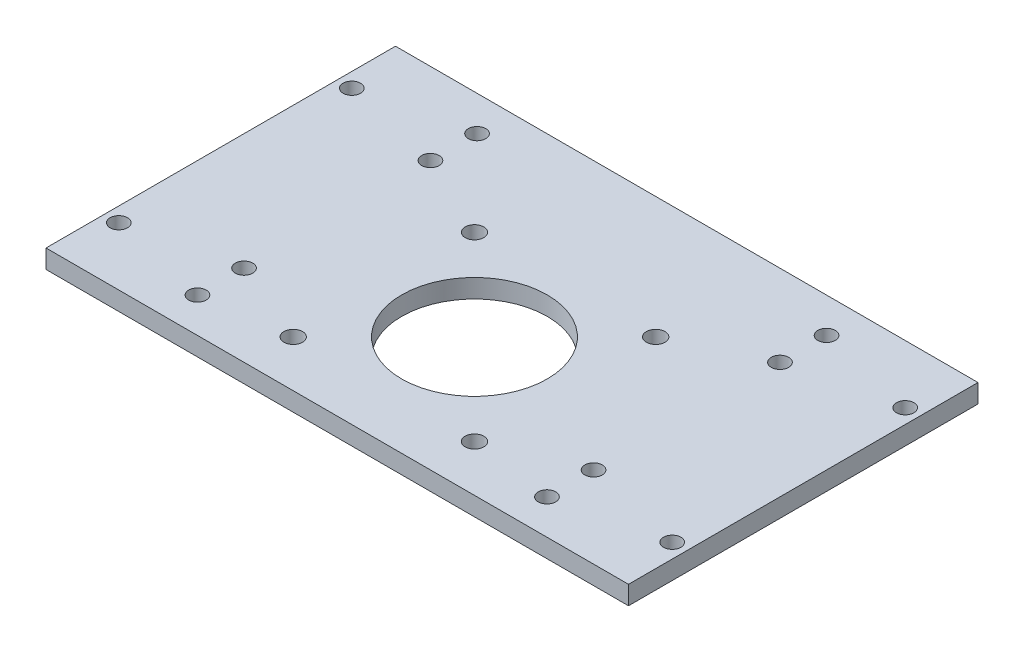
ISO-10303-21;
HEADER;
FILE_DESCRIPTION(('STEP AP214'),'2;1');
FILE_NAME('part.step','',(''),(''),'','','');
FILE_SCHEMA(('AUTOMOTIVE_DESIGN { 1 0 10303 214 1 1 1 1 }'));
ENDSEC;
DATA;
#1=APPLICATION_CONTEXT('core data for automotive mechanical design processes');
#2=APPLICATION_PROTOCOL_DEFINITION('international standard','automotive_design',2000,#1);
#3=PRODUCT_CONTEXT('',#1,'mechanical');
#4=PRODUCT('Part','Part','',(#3));
#5=PRODUCT_RELATED_PRODUCT_CATEGORY('part','',(#4));
#6=PRODUCT_DEFINITION_FORMATION('','',#4);
#7=PRODUCT_DEFINITION_CONTEXT('part definition',#1,'design');
#8=PRODUCT_DEFINITION('design','',#6,#7);
#9=PRODUCT_DEFINITION_SHAPE('','',#8);
#10=(LENGTH_UNIT() NAMED_UNIT(*) SI_UNIT(.MILLI.,.METRE.));
#11=(NAMED_UNIT(*) PLANE_ANGLE_UNIT() SI_UNIT($,.RADIAN.));
#12=(NAMED_UNIT(*) SI_UNIT($,.STERADIAN.) SOLID_ANGLE_UNIT());
#13=UNCERTAINTY_MEASURE_WITH_UNIT(LENGTH_MEASURE(1.E-05),#10,'distance_accuracy_value','');
#14=(GEOMETRIC_REPRESENTATION_CONTEXT(3) GLOBAL_UNCERTAINTY_ASSIGNED_CONTEXT((#13)) GLOBAL_UNIT_ASSIGNED_CONTEXT((#10,
#11,#12)) REPRESENTATION_CONTEXT('',''));
#15=CARTESIAN_POINT('',(0.,0.,0.));
#16=DIRECTION('',(0.,0.,1.));
#17=DIRECTION('',(1.,0.,0.));
#18=AXIS2_PLACEMENT_3D('',#15,#16,#17);
#19=CARTESIAN_POINT('',(-50.,3.2,-30.));
#20=DIRECTION('',(1.,0.,0.));
#21=DIRECTION('',(0.,0.,-1.));
#22=AXIS2_PLACEMENT_3D('',#19,#20,#21);
#23=PLANE('',#22);
#24=DIRECTION('',(0.,0.,1.));
#25=VECTOR('',#24,1.);
#26=CARTESIAN_POINT('',(-50.,0.,-30.));
#27=LINE('',#26,#25);
#28=CARTESIAN_POINT('',(-50.,0.,-30.));
#29=VERTEX_POINT('',#28);
#30=CARTESIAN_POINT('',(-50.,0.,30.));
#31=VERTEX_POINT('',#30);
#32=EDGE_CURVE('E113',#29,#31,#27,.T.);
#33=ORIENTED_EDGE('',*,*,#32,.T.);
#34=DIRECTION('',(0.,-1.,0.));
#35=VECTOR('',#34,1.);
#36=CARTESIAN_POINT('',(-50.,3.2,30.));
#37=LINE('',#36,#35);
#38=CARTESIAN_POINT('',(-50.,3.2,30.));
#39=VERTEX_POINT('',#38);
#40=EDGE_CURVE('E11',#39,#31,#37,.T.);
#41=ORIENTED_EDGE('',*,*,#40,.F.);
#42=DIRECTION('',(0.,0.,1.));
#43=VECTOR('',#42,1.);
#44=CARTESIAN_POINT('',(-50.,3.2,-30.));
#45=LINE('',#44,#43);
#46=CARTESIAN_POINT('',(-50.,3.2,-30.));
#47=VERTEX_POINT('',#46);
#48=EDGE_CURVE('E97',#47,#39,#45,.T.);
#49=ORIENTED_EDGE('',*,*,#48,.F.);
#50=DIRECTION('',(0.,-1.,0.));
#51=VECTOR('',#50,1.);
#52=CARTESIAN_POINT('',(-50.,3.2,-30.));
#53=LINE('',#52,#51);
#54=EDGE_CURVE('E109',#47,#29,#53,.T.);
#55=ORIENTED_EDGE('',*,*,#54,.T.);
#56=EDGE_LOOP('',(#33,#41,#49,#55));
#57=FACE_BOUND('',#56,.T.);
#58=ADVANCED_FACE('F45',(#57),#23,.F.);
#59=CARTESIAN_POINT('',(-50.,3.2,30.));
#60=DIRECTION('',(0.,0.,-1.));
#61=DIRECTION('',(-1.,0.,0.));
#62=AXIS2_PLACEMENT_3D('',#59,#60,#61);
#63=PLANE('',#62);
#64=DIRECTION('',(1.,0.,0.));
#65=VECTOR('',#64,1.);
#66=CARTESIAN_POINT('',(-50.,0.,30.));
#67=LINE('',#66,#65);
#68=CARTESIAN_POINT('',(50.,0.,30.));
#69=VERTEX_POINT('',#68);
#70=EDGE_CURVE('E102',#31,#69,#67,.T.);
#71=ORIENTED_EDGE('',*,*,#70,.T.);
#72=DIRECTION('',(0.,-1.,0.));
#73=VECTOR('',#72,1.);
#74=CARTESIAN_POINT('',(50.,3.2,30.));
#75=LINE('',#74,#73);
#76=CARTESIAN_POINT('',(50.,3.2,30.));
#77=VERTEX_POINT('',#76);
#78=EDGE_CURVE('E54',#77,#69,#75,.T.);
#79=ORIENTED_EDGE('',*,*,#78,.F.);
#80=DIRECTION('',(1.,0.,0.));
#81=VECTOR('',#80,1.);
#82=CARTESIAN_POINT('',(-50.,3.2,30.));
#83=LINE('',#82,#81);
#84=EDGE_CURVE('E92',#39,#77,#83,.T.);
#85=ORIENTED_EDGE('',*,*,#84,.F.);
#86=ORIENTED_EDGE('',*,*,#40,.T.);
#87=EDGE_LOOP('',(#71,#79,#85,#86));
#88=FACE_BOUND('',#87,.T.);
#89=ADVANCED_FACE('F101',(#88),#63,.F.);
#90=CARTESIAN_POINT('',(50.,3.2,-30.));
#91=DIRECTION('',(-1.,0.,0.));
#92=DIRECTION('',(0.,0.,1.));
#93=AXIS2_PLACEMENT_3D('',#90,#91,#92);
#94=PLANE('',#93);
#95=DIRECTION('',(0.,0.,-1.));
#96=VECTOR('',#95,1.);
#97=CARTESIAN_POINT('',(50.,0.,-30.));
#98=LINE('',#97,#96);
#99=CARTESIAN_POINT('',(50.,0.,-30.));
#100=VERTEX_POINT('',#99);
#101=EDGE_CURVE('E79',#69,#100,#98,.T.);
#102=ORIENTED_EDGE('',*,*,#101,.T.);
#103=DIRECTION('',(0.,-1.,0.));
#104=VECTOR('',#103,1.);
#105=CARTESIAN_POINT('',(50.,3.2,-30.));
#106=LINE('',#105,#104);
#107=CARTESIAN_POINT('',(50.,3.2,-30.));
#108=VERTEX_POINT('',#107);
#109=EDGE_CURVE('E104',#108,#100,#106,.T.);
#110=ORIENTED_EDGE('',*,*,#109,.F.);
#111=DIRECTION('',(0.,0.,-1.));
#112=VECTOR('',#111,1.);
#113=CARTESIAN_POINT('',(50.,3.2,-30.));
#114=LINE('',#113,#112);
#115=EDGE_CURVE('E95',#77,#108,#114,.T.);
#116=ORIENTED_EDGE('',*,*,#115,.F.);
#117=ORIENTED_EDGE('',*,*,#78,.T.);
#118=EDGE_LOOP('',(#102,#110,#116,#117));
#119=FACE_BOUND('',#118,.T.);
#120=ADVANCED_FACE('F105',(#119),#94,.F.);
#121=CARTESIAN_POINT('',(-50.,3.2,-30.));
#122=DIRECTION('',(0.,0.,1.));
#123=DIRECTION('',(1.,0.,0.));
#124=AXIS2_PLACEMENT_3D('',#121,#122,#123);
#125=PLANE('',#124);
#126=DIRECTION('',(-1.,0.,0.));
#127=VECTOR('',#126,1.);
#128=CARTESIAN_POINT('',(-50.,0.,-30.));
#129=LINE('',#128,#127);
#130=EDGE_CURVE('E85',#100,#29,#129,.T.);
#131=ORIENTED_EDGE('',*,*,#130,.T.);
#132=ORIENTED_EDGE('',*,*,#54,.F.);
#133=DIRECTION('',(-1.,0.,0.));
#134=VECTOR('',#133,1.);
#135=CARTESIAN_POINT('',(-50.,3.2,-30.));
#136=LINE('',#135,#134);
#137=EDGE_CURVE('E62',#108,#47,#136,.T.);
#138=ORIENTED_EDGE('',*,*,#137,.F.);
#139=ORIENTED_EDGE('',*,*,#109,.T.);
#140=EDGE_LOOP('',(#131,#132,#138,#139));
#141=FACE_BOUND('',#140,.T.);
#142=ADVANCED_FACE('F127',(#141),#125,.F.);
#143=CARTESIAN_POINT('',(0.,3.2,0.));
#144=DIRECTION('',(0.,1.,0.));
#145=DIRECTION('',(0.,0.,1.));
#146=AXIS2_PLACEMENT_3D('',#143,#144,#145);
#147=PLANE('',#146);
#148=CARTESIAN_POINT('',(47.5,3.2,-20.));
#149=DIRECTION('',(0.,1.,0.));
#150=DIRECTION('',(0.,0.,-1.));
#151=AXIS2_PLACEMENT_3D('',#148,#149,#150);
#152=CIRCLE('',#151,1.5);
#153=CARTESIAN_POINT('',(47.5,3.2,-21.5));
#154=VERTEX_POINT('',#153);
#155=EDGE_CURVE('E174',#154,#154,#152,.T.);
#156=ORIENTED_EDGE('',*,*,#155,.F.);
#157=EDGE_LOOP('',(#156));
#158=FACE_BOUND('',#157,.T.);
#159=CARTESIAN_POINT('',(47.5,3.2,20.));
#160=DIRECTION('',(0.,1.,0.));
#161=DIRECTION('',(0.,0.,-1.));
#162=AXIS2_PLACEMENT_3D('',#159,#160,#161);
#163=CIRCLE('',#162,1.5);
#164=CARTESIAN_POINT('',(47.5,3.2,18.5));
#165=VERTEX_POINT('',#164);
#166=EDGE_CURVE('E184',#165,#165,#163,.T.);
#167=ORIENTED_EDGE('',*,*,#166,.F.);
#168=EDGE_LOOP('',(#167));
#169=FACE_BOUND('',#168,.T.);
#170=CARTESIAN_POINT('',(-47.5,3.2,-20.));
#171=DIRECTION('',(0.,1.,0.));
#172=DIRECTION('',(0.,0.,1.));
#173=AXIS2_PLACEMENT_3D('',#170,#171,#172);
#174=CIRCLE('',#173,1.5);
#175=CARTESIAN_POINT('',(-47.5,3.2,-18.5));
#176=VERTEX_POINT('',#175);
#177=EDGE_CURVE('E192',#176,#176,#174,.T.);
#178=ORIENTED_EDGE('',*,*,#177,.F.);
#179=EDGE_LOOP('',(#178));
#180=FACE_BOUND('',#179,.T.);
#181=CARTESIAN_POINT('',(-15.5563491861041,3.2,22.));
#182=DIRECTION('',(0.,1.,0.));
#183=DIRECTION('',(0.,0.,1.));
#184=AXIS2_PLACEMENT_3D('',#181,#182,#183);
#185=CIRCLE('',#184,1.6);
#186=CARTESIAN_POINT('',(-15.5563491861041,3.2,23.6));
#187=VERTEX_POINT('',#186);
#188=EDGE_CURVE('E151',#187,#187,#185,.T.);
#189=ORIENTED_EDGE('',*,*,#188,.F.);
#190=EDGE_LOOP('',(#189));
#191=FACE_BOUND('',#190,.T.);
#192=CARTESIAN_POINT('',(-15.556349186104,3.2,-9.11269837220809));
#193=DIRECTION('',(0.,1.,0.));
#194=DIRECTION('',(0.,0.,1.));
#195=AXIS2_PLACEMENT_3D('',#192,#193,#194);
#196=CIRCLE('',#195,1.6);
#197=CARTESIAN_POINT('',(-15.556349186104,3.2,-7.51269837220809));
#198=VERTEX_POINT('',#197);
#199=EDGE_CURVE('E142',#198,#198,#196,.T.);
#200=ORIENTED_EDGE('',*,*,#199,.F.);
#201=EDGE_LOOP('',(#200));
#202=FACE_BOUND('',#201,.T.);
#203=CARTESIAN_POINT('',(15.556349186104,3.2,-9.11269837220807));
#204=DIRECTION('',(0.,1.,0.));
#205=DIRECTION('',(0.,0.,1.));
#206=AXIS2_PLACEMENT_3D('',#203,#204,#205);
#207=CIRCLE('',#206,1.60000000000001);
#208=CARTESIAN_POINT('',(15.556349186104,3.2,-7.51269837220806));
#209=VERTEX_POINT('',#208);
#210=EDGE_CURVE('E152',#209,#209,#207,.T.);
#211=ORIENTED_EDGE('',*,*,#210,.F.);
#212=EDGE_LOOP('',(#211));
#213=FACE_BOUND('',#212,.T.);
#214=CARTESIAN_POINT('',(-47.5,3.2,20.));
#215=DIRECTION('',(0.,1.,0.));
#216=DIRECTION('',(0.,0.,1.));
#217=AXIS2_PLACEMENT_3D('',#214,#215,#216);
#218=CIRCLE('',#217,1.5);
#219=CARTESIAN_POINT('',(-47.5,3.2,21.5));
#220=VERTEX_POINT('',#219);
#221=EDGE_CURVE('E160',#220,#220,#218,.T.);
#222=ORIENTED_EDGE('',*,*,#221,.F.);
#223=EDGE_LOOP('',(#222));
#224=FACE_BOUND('',#223,.T.);
#225=CARTESIAN_POINT('',(15.556349186104,3.2,22.));
#226=DIRECTION('',(0.,1.,0.));
#227=DIRECTION('',(0.,0.,1.));
#228=AXIS2_PLACEMENT_3D('',#225,#226,#227);
#229=CIRCLE('',#228,1.6);
#230=CARTESIAN_POINT('',(15.556349186104,3.2,23.6));
#231=VERTEX_POINT('',#230);
#232=EDGE_CURVE('E141',#231,#231,#229,.T.);
#233=ORIENTED_EDGE('',*,*,#232,.F.);
#234=EDGE_LOOP('',(#233));
#235=FACE_BOUND('',#234,.T.);
#236=CARTESIAN_POINT('',(-30.,3.2,24.));
#237=DIRECTION('',(0.,1.,0.));
#238=DIRECTION('',(0.,0.,1.));
#239=AXIS2_PLACEMENT_3D('',#236,#237,#238);
#240=CIRCLE('',#239,1.5);
#241=CARTESIAN_POINT('',(-30.,3.2,25.5));
#242=VERTEX_POINT('',#241);
#243=EDGE_CURVE('E183',#242,#242,#240,.T.);
#244=ORIENTED_EDGE('',*,*,#243,.F.);
#245=EDGE_LOOP('',(#244));
#246=FACE_BOUND('',#245,.T.);
#247=CARTESIAN_POINT('',(-30.,3.2,16.));
#248=DIRECTION('',(0.,1.,0.));
#249=DIRECTION('',(0.,0.,-1.));
#250=AXIS2_PLACEMENT_3D('',#247,#248,#249);
#251=CIRCLE('',#250,1.5);
#252=CARTESIAN_POINT('',(-30.,3.2,14.5));
#253=VERTEX_POINT('',#252);
#254=EDGE_CURVE('E255',#253,#253,#251,.T.);
#255=ORIENTED_EDGE('',*,*,#254,.F.);
#256=EDGE_LOOP('',(#255));
#257=FACE_BOUND('',#256,.T.);
#258=CARTESIAN_POINT('',(-30.,3.2,-24.));
#259=DIRECTION('',(0.,1.,0.));
#260=DIRECTION('',(0.,0.,-1.));
#261=AXIS2_PLACEMENT_3D('',#258,#259,#260);
#262=CIRCLE('',#261,1.5);
#263=CARTESIAN_POINT('',(-30.,3.2,-25.5));
#264=VERTEX_POINT('',#263);
#265=EDGE_CURVE('E247',#264,#264,#262,.T.);
#266=ORIENTED_EDGE('',*,*,#265,.F.);
#267=EDGE_LOOP('',(#266));
#268=FACE_BOUND('',#267,.T.);
#269=CARTESIAN_POINT('',(-30.,3.2,-16.));
#270=DIRECTION('',(0.,1.,0.));
#271=DIRECTION('',(0.,0.,1.));
#272=AXIS2_PLACEMENT_3D('',#269,#270,#271);
#273=CIRCLE('',#272,1.5);
#274=CARTESIAN_POINT('',(-30.,3.2,-14.5));
#275=VERTEX_POINT('',#274);
#276=EDGE_CURVE('E239',#275,#275,#273,.T.);
#277=ORIENTED_EDGE('',*,*,#276,.F.);
#278=EDGE_LOOP('',(#277));
#279=FACE_BOUND('',#278,.T.);
#280=CARTESIAN_POINT('',(30.,3.2,24.));
#281=DIRECTION('',(0.,1.,0.));
#282=DIRECTION('',(0.,0.,-1.));
#283=AXIS2_PLACEMENT_3D('',#280,#281,#282);
#284=CIRCLE('',#283,1.50000000000002);
#285=CARTESIAN_POINT('',(30.,3.2,22.5));
#286=VERTEX_POINT('',#285);
#287=EDGE_CURVE('E231',#286,#286,#284,.T.);
#288=ORIENTED_EDGE('',*,*,#287,.F.);
#289=EDGE_LOOP('',(#288));
#290=FACE_BOUND('',#289,.T.);
#291=CARTESIAN_POINT('',(30.,3.2,16.));
#292=DIRECTION('',(0.,1.,0.));
#293=DIRECTION('',(0.,0.,1.));
#294=AXIS2_PLACEMENT_3D('',#291,#292,#293);
#295=CIRCLE('',#294,1.50000000000002);
#296=CARTESIAN_POINT('',(30.,3.2,17.5));
#297=VERTEX_POINT('',#296);
#298=EDGE_CURVE('E223',#297,#297,#295,.T.);
#299=ORIENTED_EDGE('',*,*,#298,.F.);
#300=EDGE_LOOP('',(#299));
#301=FACE_BOUND('',#300,.T.);
#302=CARTESIAN_POINT('',(30.,3.2,-24.));
#303=DIRECTION('',(0.,1.,0.));
#304=DIRECTION('',(0.,0.,1.));
#305=AXIS2_PLACEMENT_3D('',#302,#303,#304);
#306=CIRCLE('',#305,1.50000000000002);
#307=CARTESIAN_POINT('',(30.,3.2,-22.5));
#308=VERTEX_POINT('',#307);
#309=EDGE_CURVE('E215',#308,#308,#306,.T.);
#310=ORIENTED_EDGE('',*,*,#309,.F.);
#311=EDGE_LOOP('',(#310));
#312=FACE_BOUND('',#311,.T.);
#313=CARTESIAN_POINT('',(30.,3.2,-16.));
#314=DIRECTION('',(0.,1.,0.));
#315=DIRECTION('',(0.,0.,-1.));
#316=AXIS2_PLACEMENT_3D('',#313,#314,#315);
#317=CIRCLE('',#316,1.50000000000002);
#318=CARTESIAN_POINT('',(30.,3.2,-17.5));
#319=VERTEX_POINT('',#318);
#320=EDGE_CURVE('E206',#319,#319,#317,.T.);
#321=ORIENTED_EDGE('',*,*,#320,.F.);
#322=EDGE_LOOP('',(#321));
#323=FACE_BOUND('',#322,.T.);
#324=CARTESIAN_POINT('',(0.,3.2,6.44365081389596));
#325=DIRECTION('',(0.,1.,0.));
#326=DIRECTION('',(0.,0.,1.));
#327=AXIS2_PLACEMENT_3D('',#324,#325,#326);
#328=CIRCLE('',#327,12.5);
#329=CARTESIAN_POINT('',(0.,3.2,18.943650813896));
#330=VERTEX_POINT('',#329);
#331=EDGE_CURVE('E137',#330,#330,#328,.T.);
#332=ORIENTED_EDGE('',*,*,#331,.F.);
#333=EDGE_LOOP('',(#332));
#334=FACE_BOUND('',#333,.T.);
#335=ORIENTED_EDGE('',*,*,#48,.T.);
#336=ORIENTED_EDGE('',*,*,#84,.T.);
#337=ORIENTED_EDGE('',*,*,#115,.T.);
#338=ORIENTED_EDGE('',*,*,#137,.T.);
#339=EDGE_LOOP('',(#335,#336,#337,#338));
#340=FACE_BOUND('',#339,.T.);
#341=ADVANCED_FACE('F93',(#158,#169,#180,#191,#202,#213,#224,#235,#246,#257,#268,#279,#290,#301,
#312,#323,#334,#340),#147,.T.);
#342=CARTESIAN_POINT('',(0.,0.,0.));
#343=DIRECTION('',(0.,1.,0.));
#344=DIRECTION('',(0.,0.,1.));
#345=AXIS2_PLACEMENT_3D('',#342,#343,#344);
#346=PLANE('',#345);
#347=CARTESIAN_POINT('',(47.5,0.,-20.));
#348=DIRECTION('',(0.,1.,0.));
#349=DIRECTION('',(0.,0.,1.));
#350=AXIS2_PLACEMENT_3D('',#347,#348,#349);
#351=CIRCLE('',#350,1.5);
#352=CARTESIAN_POINT('',(47.5,0.,-18.5));
#353=VERTEX_POINT('',#352);
#354=EDGE_CURVE('E179',#353,#353,#351,.F.);
#355=ORIENTED_EDGE('',*,*,#354,.F.);
#356=EDGE_LOOP('',(#355));
#357=FACE_BOUND('',#356,.T.);
#358=CARTESIAN_POINT('',(47.5,0.,20.));
#359=DIRECTION('',(0.,1.,0.));
#360=DIRECTION('',(0.,0.,1.));
#361=AXIS2_PLACEMENT_3D('',#358,#359,#360);
#362=CIRCLE('',#361,1.5);
#363=CARTESIAN_POINT('',(47.5,0.,21.5));
#364=VERTEX_POINT('',#363);
#365=EDGE_CURVE('E178',#364,#364,#362,.F.);
#366=ORIENTED_EDGE('',*,*,#365,.F.);
#367=EDGE_LOOP('',(#366));
#368=FACE_BOUND('',#367,.T.);
#369=CARTESIAN_POINT('',(-47.5,0.,-20.));
#370=DIRECTION('',(0.,1.,0.));
#371=DIRECTION('',(0.,0.,1.));
#372=AXIS2_PLACEMENT_3D('',#369,#370,#371);
#373=CIRCLE('',#372,1.5);
#374=CARTESIAN_POINT('',(-47.5,0.,-18.5));
#375=VERTEX_POINT('',#374);
#376=EDGE_CURVE('E188',#375,#375,#373,.F.);
#377=ORIENTED_EDGE('',*,*,#376,.F.);
#378=EDGE_LOOP('',(#377));
#379=FACE_BOUND('',#378,.T.);
#380=CARTESIAN_POINT('',(-15.5563491861041,0.,22.));
#381=DIRECTION('',(0.,1.,0.));
#382=DIRECTION('',(0.,0.,1.));
#383=AXIS2_PLACEMENT_3D('',#380,#381,#382);
#384=CIRCLE('',#383,1.6);
#385=CARTESIAN_POINT('',(-15.5563491861041,0.,23.6));
#386=VERTEX_POINT('',#385);
#387=EDGE_CURVE('E196',#386,#386,#384,.F.);
#388=ORIENTED_EDGE('',*,*,#387,.F.);
#389=EDGE_LOOP('',(#388));
#390=FACE_BOUND('',#389,.T.);
#391=CARTESIAN_POINT('',(-15.556349186104,0.,-9.11269837220809));
#392=DIRECTION('',(0.,1.,0.));
#393=DIRECTION('',(0.,0.,1.));
#394=AXIS2_PLACEMENT_3D('',#391,#392,#393);
#395=CIRCLE('',#394,1.6);
#396=CARTESIAN_POINT('',(-15.556349186104,0.,-7.51269837220809));
#397=VERTEX_POINT('',#396);
#398=EDGE_CURVE('E147',#397,#397,#395,.F.);
#399=ORIENTED_EDGE('',*,*,#398,.F.);
#400=EDGE_LOOP('',(#399));
#401=FACE_BOUND('',#400,.T.);
#402=CARTESIAN_POINT('',(15.556349186104,0.,-9.11269837220807));
#403=DIRECTION('',(0.,1.,0.));
#404=DIRECTION('',(0.,0.,1.));
#405=AXIS2_PLACEMENT_3D('',#402,#403,#404);
#406=CIRCLE('',#405,1.60000000000001);
#407=CARTESIAN_POINT('',(15.556349186104,0.,-7.51269837220806));
#408=VERTEX_POINT('',#407);
#409=EDGE_CURVE('E146',#408,#408,#406,.F.);
#410=ORIENTED_EDGE('',*,*,#409,.F.);
#411=EDGE_LOOP('',(#410));
#412=FACE_BOUND('',#411,.T.);
#413=CARTESIAN_POINT('',(-47.5,0.,20.));
#414=DIRECTION('',(0.,1.,0.));
#415=DIRECTION('',(0.,0.,1.));
#416=AXIS2_PLACEMENT_3D('',#413,#414,#415);
#417=CIRCLE('',#416,1.5);
#418=CARTESIAN_POINT('',(-47.5,0.,21.5));
#419=VERTEX_POINT('',#418);
#420=EDGE_CURVE('E156',#419,#419,#417,.F.);
#421=ORIENTED_EDGE('',*,*,#420,.F.);
#422=EDGE_LOOP('',(#421));
#423=FACE_BOUND('',#422,.T.);
#424=CARTESIAN_POINT('',(15.556349186104,0.,22.));
#425=DIRECTION('',(0.,1.,0.));
#426=DIRECTION('',(0.,0.,1.));
#427=AXIS2_PLACEMENT_3D('',#424,#425,#426);
#428=CIRCLE('',#427,1.6);
#429=CARTESIAN_POINT('',(15.556349186104,0.,23.6));
#430=VERTEX_POINT('',#429);
#431=EDGE_CURVE('E164',#430,#430,#428,.F.);
#432=ORIENTED_EDGE('',*,*,#431,.F.);
#433=EDGE_LOOP('',(#432));
#434=FACE_BOUND('',#433,.T.);
#435=CARTESIAN_POINT('',(-30.,0.,24.));
#436=DIRECTION('',(0.,1.,0.));
#437=DIRECTION('',(0.,0.,1.));
#438=AXIS2_PLACEMENT_3D('',#435,#436,#437);
#439=CIRCLE('',#438,1.5);
#440=CARTESIAN_POINT('',(-30.,0.,25.5));
#441=VERTEX_POINT('',#440);
#442=EDGE_CURVE('E259',#441,#441,#439,.F.);
#443=ORIENTED_EDGE('',*,*,#442,.F.);
#444=EDGE_LOOP('',(#443));
#445=FACE_BOUND('',#444,.T.);
#446=CARTESIAN_POINT('',(-30.,0.,16.));
#447=DIRECTION('',(0.,1.,0.));
#448=DIRECTION('',(0.,0.,1.));
#449=AXIS2_PLACEMENT_3D('',#446,#447,#448);
#450=CIRCLE('',#449,1.5);
#451=CARTESIAN_POINT('',(-30.,0.,17.5));
#452=VERTEX_POINT('',#451);
#453=EDGE_CURVE('E251',#452,#452,#450,.F.);
#454=ORIENTED_EDGE('',*,*,#453,.F.);
#455=EDGE_LOOP('',(#454));
#456=FACE_BOUND('',#455,.T.);
#457=CARTESIAN_POINT('',(-30.,0.,-24.));
#458=DIRECTION('',(0.,1.,0.));
#459=DIRECTION('',(0.,0.,1.));
#460=AXIS2_PLACEMENT_3D('',#457,#458,#459);
#461=CIRCLE('',#460,1.5);
#462=CARTESIAN_POINT('',(-30.,0.,-22.5));
#463=VERTEX_POINT('',#462);
#464=EDGE_CURVE('E243',#463,#463,#461,.F.);
#465=ORIENTED_EDGE('',*,*,#464,.F.);
#466=EDGE_LOOP('',(#465));
#467=FACE_BOUND('',#466,.T.);
#468=CARTESIAN_POINT('',(-30.,0.,-16.));
#469=DIRECTION('',(0.,1.,0.));
#470=DIRECTION('',(0.,0.,1.));
#471=AXIS2_PLACEMENT_3D('',#468,#469,#470);
#472=CIRCLE('',#471,1.5);
#473=CARTESIAN_POINT('',(-30.,0.,-14.5));
#474=VERTEX_POINT('',#473);
#475=EDGE_CURVE('E235',#474,#474,#472,.F.);
#476=ORIENTED_EDGE('',*,*,#475,.F.);
#477=EDGE_LOOP('',(#476));
#478=FACE_BOUND('',#477,.T.);
#479=CARTESIAN_POINT('',(30.,0.,24.));
#480=DIRECTION('',(0.,1.,0.));
#481=DIRECTION('',(0.,0.,1.));
#482=AXIS2_PLACEMENT_3D('',#479,#480,#481);
#483=CIRCLE('',#482,1.50000000000002);
#484=CARTESIAN_POINT('',(30.,0.,25.5));
#485=VERTEX_POINT('',#484);
#486=EDGE_CURVE('E227',#485,#485,#483,.F.);
#487=ORIENTED_EDGE('',*,*,#486,.F.);
#488=EDGE_LOOP('',(#487));
#489=FACE_BOUND('',#488,.T.);
#490=CARTESIAN_POINT('',(30.,0.,16.));
#491=DIRECTION('',(0.,1.,0.));
#492=DIRECTION('',(0.,0.,1.));
#493=AXIS2_PLACEMENT_3D('',#490,#491,#492);
#494=CIRCLE('',#493,1.50000000000002);
#495=CARTESIAN_POINT('',(30.,0.,17.5));
#496=VERTEX_POINT('',#495);
#497=EDGE_CURVE('E219',#496,#496,#494,.F.);
#498=ORIENTED_EDGE('',*,*,#497,.F.);
#499=EDGE_LOOP('',(#498));
#500=FACE_BOUND('',#499,.T.);
#501=CARTESIAN_POINT('',(30.,0.,-24.));
#502=DIRECTION('',(0.,1.,0.));
#503=DIRECTION('',(0.,0.,1.));
#504=AXIS2_PLACEMENT_3D('',#501,#502,#503);
#505=CIRCLE('',#504,1.50000000000002);
#506=CARTESIAN_POINT('',(30.,0.,-22.5));
#507=VERTEX_POINT('',#506);
#508=EDGE_CURVE('E210',#507,#507,#505,.F.);
#509=ORIENTED_EDGE('',*,*,#508,.F.);
#510=EDGE_LOOP('',(#509));
#511=FACE_BOUND('',#510,.T.);
#512=CARTESIAN_POINT('',(30.,0.,-16.));
#513=DIRECTION('',(0.,1.,0.));
#514=DIRECTION('',(0.,0.,1.));
#515=AXIS2_PLACEMENT_3D('',#512,#513,#514);
#516=CIRCLE('',#515,1.50000000000002);
#517=CARTESIAN_POINT('',(30.,0.,-14.5));
#518=VERTEX_POINT('',#517);
#519=EDGE_CURVE('E211',#518,#518,#516,.F.);
#520=ORIENTED_EDGE('',*,*,#519,.F.);
#521=EDGE_LOOP('',(#520));
#522=FACE_BOUND('',#521,.T.);
#523=CARTESIAN_POINT('',(0.,0.,6.44365081389596));
#524=DIRECTION('',(0.,1.,0.));
#525=DIRECTION('',(0.,0.,1.));
#526=AXIS2_PLACEMENT_3D('',#523,#524,#525);
#527=CIRCLE('',#526,12.5);
#528=CARTESIAN_POINT('',(0.,0.,18.943650813896));
#529=VERTEX_POINT('',#528);
#530=EDGE_CURVE('E117',#529,#529,#527,.F.);
#531=ORIENTED_EDGE('',*,*,#530,.F.);
#532=EDGE_LOOP('',(#531));
#533=FACE_BOUND('',#532,.T.);
#534=ORIENTED_EDGE('',*,*,#32,.F.);
#535=ORIENTED_EDGE('',*,*,#130,.F.);
#536=ORIENTED_EDGE('',*,*,#101,.F.);
#537=ORIENTED_EDGE('',*,*,#70,.F.);
#538=EDGE_LOOP('',(#534,#535,#536,#537));
#539=FACE_BOUND('',#538,.T.);
#540=ADVANCED_FACE('F130',(#357,#368,#379,#390,#401,#412,#423,#434,#445,#456,#467,#478,#489,
#500,#511,#522,#533,#539),#346,.F.);
#541=CARTESIAN_POINT('',(0.,-35.3553390593274,6.44365081389596));
#542=DIRECTION('',(0.,1.,0.));
#543=DIRECTION('',(0.,0.,1.));
#544=AXIS2_PLACEMENT_3D('',#541,#542,#543);
#545=CYLINDRICAL_SURFACE('',#544,12.5);
#546=ORIENTED_EDGE('',*,*,#530,.T.);
#547=EDGE_LOOP('',(#546));
#548=FACE_BOUND('',#547,.T.);
#549=ORIENTED_EDGE('',*,*,#331,.T.);
#550=EDGE_LOOP('',(#549));
#551=FACE_BOUND('',#550,.T.);
#552=ADVANCED_FACE('F275',(#548,#551),#545,.F.);
#553=CARTESIAN_POINT('',(30.,-35.3553390593274,-16.));
#554=DIRECTION('',(0.,1.,0.));
#555=DIRECTION('',(0.,0.,1.));
#556=AXIS2_PLACEMENT_3D('',#553,#554,#555);
#557=CYLINDRICAL_SURFACE('',#556,1.50000000000002);
#558=ORIENTED_EDGE('',*,*,#519,.T.);
#559=EDGE_LOOP('',(#558));
#560=FACE_BOUND('',#559,.T.);
#561=ORIENTED_EDGE('',*,*,#320,.T.);
#562=EDGE_LOOP('',(#561));
#563=FACE_BOUND('',#562,.T.);
#564=ADVANCED_FACE('F296',(#560,#563),#557,.F.);
#565=CARTESIAN_POINT('',(30.,-35.3553390593274,-24.));
#566=DIRECTION('',(0.,1.,0.));
#567=DIRECTION('',(0.,0.,1.));
#568=AXIS2_PLACEMENT_3D('',#565,#566,#567);
#569=CYLINDRICAL_SURFACE('',#568,1.50000000000002);
#570=ORIENTED_EDGE('',*,*,#508,.T.);
#571=EDGE_LOOP('',(#570));
#572=FACE_BOUND('',#571,.T.);
#573=ORIENTED_EDGE('',*,*,#309,.T.);
#574=EDGE_LOOP('',(#573));
#575=FACE_BOUND('',#574,.T.);
#576=ADVANCED_FACE('F350',(#572,#575),#569,.F.);
#577=CARTESIAN_POINT('',(30.,-35.3553390593274,16.));
#578=DIRECTION('',(0.,1.,0.));
#579=DIRECTION('',(0.,0.,1.));
#580=AXIS2_PLACEMENT_3D('',#577,#578,#579);
#581=CYLINDRICAL_SURFACE('',#580,1.50000000000002);
#582=ORIENTED_EDGE('',*,*,#497,.T.);
#583=EDGE_LOOP('',(#582));
#584=FACE_BOUND('',#583,.T.);
#585=ORIENTED_EDGE('',*,*,#298,.T.);
#586=EDGE_LOOP('',(#585));
#587=FACE_BOUND('',#586,.T.);
#588=ADVANCED_FACE('F360',(#584,#587),#581,.F.);
#589=CARTESIAN_POINT('',(30.,-35.3553390593274,24.));
#590=DIRECTION('',(0.,1.,0.));
#591=DIRECTION('',(0.,0.,1.));
#592=AXIS2_PLACEMENT_3D('',#589,#590,#591);
#593=CYLINDRICAL_SURFACE('',#592,1.50000000000002);
#594=ORIENTED_EDGE('',*,*,#486,.T.);
#595=EDGE_LOOP('',(#594));
#596=FACE_BOUND('',#595,.T.);
#597=ORIENTED_EDGE('',*,*,#287,.T.);
#598=EDGE_LOOP('',(#597));
#599=FACE_BOUND('',#598,.T.);
#600=ADVANCED_FACE('F370',(#596,#599),#593,.F.);
#601=CARTESIAN_POINT('',(-30.,-35.3553390593274,-16.));
#602=DIRECTION('',(0.,1.,0.));
#603=DIRECTION('',(0.,0.,1.));
#604=AXIS2_PLACEMENT_3D('',#601,#602,#603);
#605=CYLINDRICAL_SURFACE('',#604,1.5);
#606=ORIENTED_EDGE('',*,*,#475,.T.);
#607=EDGE_LOOP('',(#606));
#608=FACE_BOUND('',#607,.T.);
#609=ORIENTED_EDGE('',*,*,#276,.T.);
#610=EDGE_LOOP('',(#609));
#611=FACE_BOUND('',#610,.T.);
#612=ADVANCED_FACE('F380',(#608,#611),#605,.F.);
#613=CARTESIAN_POINT('',(-30.,-35.3553390593274,-24.));
#614=DIRECTION('',(0.,1.,0.));
#615=DIRECTION('',(0.,0.,1.));
#616=AXIS2_PLACEMENT_3D('',#613,#614,#615);
#617=CYLINDRICAL_SURFACE('',#616,1.5);
#618=ORIENTED_EDGE('',*,*,#464,.T.);
#619=EDGE_LOOP('',(#618));
#620=FACE_BOUND('',#619,.T.);
#621=ORIENTED_EDGE('',*,*,#265,.T.);
#622=EDGE_LOOP('',(#621));
#623=FACE_BOUND('',#622,.T.);
#624=ADVANCED_FACE('F390',(#620,#623),#617,.F.);
#625=CARTESIAN_POINT('',(-30.,-35.3553390593274,16.));
#626=DIRECTION('',(0.,1.,0.));
#627=DIRECTION('',(0.,0.,1.));
#628=AXIS2_PLACEMENT_3D('',#625,#626,#627);
#629=CYLINDRICAL_SURFACE('',#628,1.5);
#630=ORIENTED_EDGE('',*,*,#453,.T.);
#631=EDGE_LOOP('',(#630));
#632=FACE_BOUND('',#631,.T.);
#633=ORIENTED_EDGE('',*,*,#254,.T.);
#634=EDGE_LOOP('',(#633));
#635=FACE_BOUND('',#634,.T.);
#636=ADVANCED_FACE('F400',(#632,#635),#629,.F.);
#637=CARTESIAN_POINT('',(-30.,-35.3553390593274,24.));
#638=DIRECTION('',(0.,1.,0.));
#639=DIRECTION('',(0.,0.,1.));
#640=AXIS2_PLACEMENT_3D('',#637,#638,#639);
#641=CYLINDRICAL_SURFACE('',#640,1.5);
#642=ORIENTED_EDGE('',*,*,#442,.T.);
#643=EDGE_LOOP('',(#642));
#644=FACE_BOUND('',#643,.T.);
#645=ORIENTED_EDGE('',*,*,#243,.T.);
#646=EDGE_LOOP('',(#645));
#647=FACE_BOUND('',#646,.T.);
#648=ADVANCED_FACE('F270',(#644,#647),#641,.F.);
#649=CARTESIAN_POINT('',(15.556349186104,-35.3553390593274,22.));
#650=DIRECTION('',(0.,1.,0.));
#651=DIRECTION('',(0.,0.,1.));
#652=AXIS2_PLACEMENT_3D('',#649,#650,#651);
#653=CYLINDRICAL_SURFACE('',#652,1.6);
#654=ORIENTED_EDGE('',*,*,#431,.T.);
#655=EDGE_LOOP('',(#654));
#656=FACE_BOUND('',#655,.T.);
#657=ORIENTED_EDGE('',*,*,#232,.T.);
#658=EDGE_LOOP('',(#657));
#659=FACE_BOUND('',#658,.T.);
#660=ADVANCED_FACE('F419',(#656,#659),#653,.F.);
#661=CARTESIAN_POINT('',(-47.5,-35.3553390593274,20.));
#662=DIRECTION('',(0.,1.,0.));
#663=DIRECTION('',(0.,0.,1.));
#664=AXIS2_PLACEMENT_3D('',#661,#662,#663);
#665=CYLINDRICAL_SURFACE('',#664,1.5);
#666=ORIENTED_EDGE('',*,*,#420,.T.);
#667=EDGE_LOOP('',(#666));
#668=FACE_BOUND('',#667,.T.);
#669=ORIENTED_EDGE('',*,*,#221,.T.);
#670=EDGE_LOOP('',(#669));
#671=FACE_BOUND('',#670,.T.);
#672=ADVANCED_FACE('F428',(#668,#671),#665,.F.);
#673=CARTESIAN_POINT('',(15.556349186104,-35.3553390593274,-9.11269837220807));
#674=DIRECTION('',(0.,1.,0.));
#675=DIRECTION('',(0.,0.,1.));
#676=AXIS2_PLACEMENT_3D('',#673,#674,#675);
#677=CYLINDRICAL_SURFACE('',#676,1.60000000000001);
#678=ORIENTED_EDGE('',*,*,#409,.T.);
#679=EDGE_LOOP('',(#678));
#680=FACE_BOUND('',#679,.T.);
#681=ORIENTED_EDGE('',*,*,#210,.T.);
#682=EDGE_LOOP('',(#681));
#683=FACE_BOUND('',#682,.T.);
#684=ADVANCED_FACE('F438',(#680,#683),#677,.F.);
#685=CARTESIAN_POINT('',(-15.556349186104,-35.3553390593274,-9.11269837220809));
#686=DIRECTION('',(0.,1.,0.));
#687=DIRECTION('',(0.,0.,1.));
#688=AXIS2_PLACEMENT_3D('',#685,#686,#687);
#689=CYLINDRICAL_SURFACE('',#688,1.6);
#690=ORIENTED_EDGE('',*,*,#398,.T.);
#691=EDGE_LOOP('',(#690));
#692=FACE_BOUND('',#691,.T.);
#693=ORIENTED_EDGE('',*,*,#199,.T.);
#694=EDGE_LOOP('',(#693));
#695=FACE_BOUND('',#694,.T.);
#696=ADVANCED_FACE('F448',(#692,#695),#689,.F.);
#697=CARTESIAN_POINT('',(-15.5563491861041,-35.3553390593274,22.));
#698=DIRECTION('',(0.,1.,0.));
#699=DIRECTION('',(0.,0.,1.));
#700=AXIS2_PLACEMENT_3D('',#697,#698,#699);
#701=CYLINDRICAL_SURFACE('',#700,1.6);
#702=ORIENTED_EDGE('',*,*,#387,.T.);
#703=EDGE_LOOP('',(#702));
#704=FACE_BOUND('',#703,.T.);
#705=ORIENTED_EDGE('',*,*,#188,.T.);
#706=EDGE_LOOP('',(#705));
#707=FACE_BOUND('',#706,.T.);
#708=ADVANCED_FACE('F458',(#704,#707),#701,.F.);
#709=CARTESIAN_POINT('',(-47.5,-35.3553390593274,-20.));
#710=DIRECTION('',(0.,1.,0.));
#711=DIRECTION('',(0.,0.,1.));
#712=AXIS2_PLACEMENT_3D('',#709,#710,#711);
#713=CYLINDRICAL_SURFACE('',#712,1.5);
#714=ORIENTED_EDGE('',*,*,#376,.T.);
#715=EDGE_LOOP('',(#714));
#716=FACE_BOUND('',#715,.T.);
#717=ORIENTED_EDGE('',*,*,#177,.T.);
#718=EDGE_LOOP('',(#717));
#719=FACE_BOUND('',#718,.T.);
#720=ADVANCED_FACE('F468',(#716,#719),#713,.F.);
#721=CARTESIAN_POINT('',(47.5,-35.3553390593274,20.));
#722=DIRECTION('',(0.,1.,0.));
#723=DIRECTION('',(0.,0.,1.));
#724=AXIS2_PLACEMENT_3D('',#721,#722,#723);
#725=CYLINDRICAL_SURFACE('',#724,1.5);
#726=ORIENTED_EDGE('',*,*,#365,.T.);
#727=EDGE_LOOP('',(#726));
#728=FACE_BOUND('',#727,.T.);
#729=ORIENTED_EDGE('',*,*,#166,.T.);
#730=EDGE_LOOP('',(#729));
#731=FACE_BOUND('',#730,.T.);
#732=ADVANCED_FACE('F478',(#728,#731),#725,.F.);
#733=CARTESIAN_POINT('',(47.5,-35.3553390593274,-20.));
#734=DIRECTION('',(0.,1.,0.));
#735=DIRECTION('',(0.,0.,1.));
#736=AXIS2_PLACEMENT_3D('',#733,#734,#735);
#737=CYLINDRICAL_SURFACE('',#736,1.5);
#738=ORIENTED_EDGE('',*,*,#354,.T.);
#739=EDGE_LOOP('',(#738));
#740=FACE_BOUND('',#739,.T.);
#741=ORIENTED_EDGE('',*,*,#155,.T.);
#742=EDGE_LOOP('',(#741));
#743=FACE_BOUND('',#742,.T.);
#744=ADVANCED_FACE('F488',(#740,#743),#737,.F.);
#745=CLOSED_SHELL('',(#58,#89,#120,#142,#341,#540,#552,#564,#576,#588,#600,#612,#624,#636,#648,
#660,#672,#684,#696,#708,#720,#732,#744));
#746=MANIFOLD_SOLID_BREP('B2',#745);
#747=ADVANCED_BREP_SHAPE_REPRESENTATION('',(#18,#746),#14);
#748=SHAPE_DEFINITION_REPRESENTATION(#9,#747);
ENDSEC;
END-ISO-10303-21;
